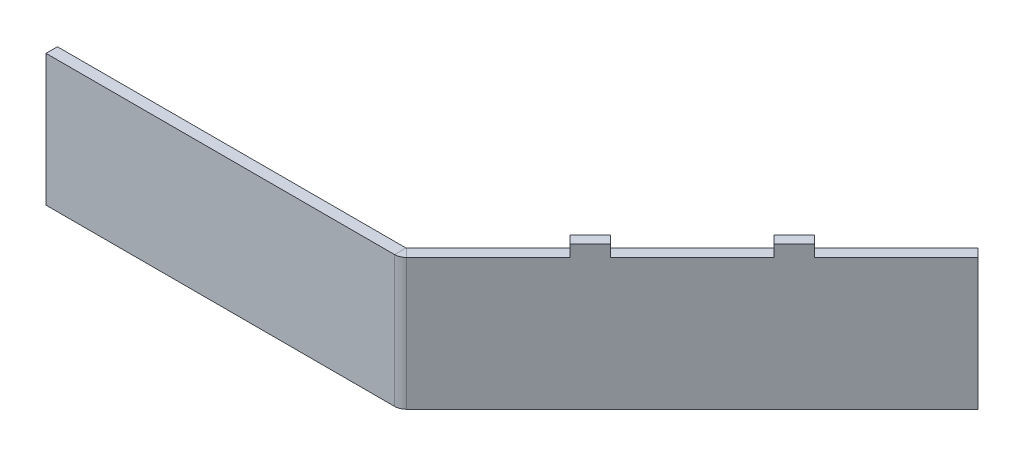
ISO-10303-21;
HEADER;
FILE_DESCRIPTION(('STEP AP214'),'2;1');
FILE_NAME('part.step','',(''),(''),'','','');
FILE_SCHEMA(('AUTOMOTIVE_DESIGN { 1 0 10303 214 1 1 1 1 }'));
ENDSEC;
DATA;
#1=APPLICATION_CONTEXT('core data for automotive mechanical design processes');
#2=APPLICATION_PROTOCOL_DEFINITION('international standard','automotive_design',2000,#1);
#3=PRODUCT_CONTEXT('',#1,'mechanical');
#4=PRODUCT('Part','Part','',(#3));
#5=PRODUCT_RELATED_PRODUCT_CATEGORY('part','',(#4));
#6=PRODUCT_DEFINITION_FORMATION('','',#4);
#7=PRODUCT_DEFINITION_CONTEXT('part definition',#1,'design');
#8=PRODUCT_DEFINITION('design','',#6,#7);
#9=PRODUCT_DEFINITION_SHAPE('','',#8);
#10=(LENGTH_UNIT() NAMED_UNIT(*) SI_UNIT(.MILLI.,.METRE.));
#11=(NAMED_UNIT(*) PLANE_ANGLE_UNIT() SI_UNIT($,.RADIAN.));
#12=(NAMED_UNIT(*) SI_UNIT($,.STERADIAN.) SOLID_ANGLE_UNIT());
#13=UNCERTAINTY_MEASURE_WITH_UNIT(LENGTH_MEASURE(1.E-05),#10,'distance_accuracy_value','');
#14=(GEOMETRIC_REPRESENTATION_CONTEXT(3) GLOBAL_UNCERTAINTY_ASSIGNED_CONTEXT((#13)) GLOBAL_UNIT_ASSIGNED_CONTEXT((#10,
#11,#12)) REPRESENTATION_CONTEXT('',''));
#15=CARTESIAN_POINT('',(0.,0.,0.));
#16=DIRECTION('',(0.,0.,1.));
#17=DIRECTION('',(1.,0.,0.));
#18=AXIS2_PLACEMENT_3D('',#15,#16,#17);
#19=CARTESIAN_POINT('',(-498.,-178.,-277.306535680569));
#20=DIRECTION('',(1.,0.,0.));
#21=DIRECTION('',(0.,0.,-1.));
#22=AXIS2_PLACEMENT_3D('',#19,#20,#21);
#23=PLANE('',#22);
#24=DIRECTION('',(0.,0.,1.));
#25=VECTOR('',#24,1.);
#26=CARTESIAN_POINT('',(-498.,-203.,-277.306535680568));
#27=LINE('',#26,#25);
#28=CARTESIAN_POINT('',(-498.,-203.,-149.));
#29=VERTEX_POINT('',#28);
#30=CARTESIAN_POINT('',(-498.,-203.,-147.));
#31=VERTEX_POINT('',#30);
#32=EDGE_CURVE('E206',#29,#31,#27,.T.);
#33=ORIENTED_EDGE('',*,*,#32,.T.);
#34=DIRECTION('',(0.,-1.,0.));
#35=VECTOR('',#34,1.);
#36=CARTESIAN_POINT('',(-498.,-203.,-147.));
#37=LINE('',#36,#35);
#38=CARTESIAN_POINT('',(-498.,-180.,-147.));
#39=VERTEX_POINT('',#38);
#40=EDGE_CURVE('E185',#39,#31,#37,.T.);
#41=ORIENTED_EDGE('',*,*,#40,.F.);
#42=DIRECTION('',(0.,0.,1.));
#43=VECTOR('',#42,1.);
#44=CARTESIAN_POINT('',(-498.,-180.,-277.306535680569));
#45=LINE('',#44,#43);
#46=CARTESIAN_POINT('',(-498.,-180.,-149.));
#47=VERTEX_POINT('',#46);
#48=EDGE_CURVE('E247',#47,#39,#45,.T.);
#49=ORIENTED_EDGE('',*,*,#48,.F.);
#50=DIRECTION('',(0.,1.,0.));
#51=VECTOR('',#50,1.);
#52=CARTESIAN_POINT('',(-498.,-178.,-149.));
#53=LINE('',#52,#51);
#54=EDGE_CURVE('E12',#29,#47,#53,.T.);
#55=ORIENTED_EDGE('',*,*,#54,.F.);
#56=EDGE_LOOP('',(#33,#41,#49,#55));
#57=FACE_BOUND('',#56,.T.);
#58=ADVANCED_FACE('F49',(#57),#23,.F.);
#59=CARTESIAN_POINT('',(-2.4980018054066E-13,-203.,-277.306535680569));
#60=DIRECTION('',(0.,-1.,0.));
#61=DIRECTION('',(0.707106781186548,0.,-0.707106781186548));
#62=AXIS2_PLACEMENT_3D('',#59,#60,#61);
#63=PLANE('',#62);
#64=DIRECTION('',(-1.,0.,0.));
#65=VECTOR('',#64,1.);
#66=CARTESIAN_POINT('',(1.11022302462516E-13,-203.,-147.));
#67=LINE('',#66,#65);
#68=CARTESIAN_POINT('',(-437.041421356238,-203.,-147.));
#69=VERTEX_POINT('',#68);
#70=EDGE_CURVE('E199',#69,#31,#67,.T.);
#71=ORIENTED_EDGE('',*,*,#70,.T.);
#72=ORIENTED_EDGE('',*,*,#32,.F.);
#73=DIRECTION('',(1.,0.,0.));
#74=VECTOR('',#73,1.);
#75=CARTESIAN_POINT('',(-1.94289029309402E-13,-203.,-149.000000000001));
#76=LINE('',#75,#74);
#77=CARTESIAN_POINT('',(-437.041421356237,-203.,-149.));
#78=VERTEX_POINT('',#77);
#79=EDGE_CURVE('E205',#29,#78,#76,.T.);
#80=ORIENTED_EDGE('',*,*,#79,.T.);
#81=DIRECTION('',(0.,0.,1.));
#82=VECTOR('',#81,1.);
#83=CARTESIAN_POINT('',(-437.041421356237,-203.,-277.306535680569));
#84=LINE('',#83,#82);
#85=EDGE_CURVE('E186',#78,#69,#84,.T.);
#86=ORIENTED_EDGE('',*,*,#85,.T.);
#87=EDGE_LOOP('',(#71,#72,#80,#86));
#88=FACE_BOUND('',#87,.T.);
#89=ADVANCED_FACE('F209',(#88),#63,.T.);
#90=CARTESIAN_POINT('',(1.11022302462516E-13,-203.,-147.));
#91=DIRECTION('',(0.,0.,-1.));
#92=DIRECTION('',(-1.,0.,0.));
#93=AXIS2_PLACEMENT_3D('',#90,#91,#92);
#94=PLANE('',#93);
#95=ORIENTED_EDGE('',*,*,#70,.F.);
#96=DIRECTION('',(0.,1.,0.));
#97=VECTOR('',#96,1.);
#98=CARTESIAN_POINT('',(-437.041421356237,-203.,-147.));
#99=LINE('',#98,#97);
#100=CARTESIAN_POINT('',(-437.041421356237,-180.,-147.));
#101=VERTEX_POINT('',#100);
#102=EDGE_CURVE('E179',#69,#101,#99,.T.);
#103=ORIENTED_EDGE('',*,*,#102,.T.);
#104=DIRECTION('',(1.,0.,0.));
#105=VECTOR('',#104,1.);
#106=CARTESIAN_POINT('',(0.,-180.,-147.));
#107=LINE('',#106,#105);
#108=EDGE_CURVE('E81',#39,#101,#107,.T.);
#109=ORIENTED_EDGE('',*,*,#108,.F.);
#110=ORIENTED_EDGE('',*,*,#40,.T.);
#111=EDGE_LOOP('',(#95,#103,#109,#110));
#112=FACE_BOUND('',#111,.T.);
#113=ADVANCED_FACE('F200',(#112),#94,.F.);
#114=CARTESIAN_POINT('',(-500.,-180.,-277.306535680569));
#115=DIRECTION('',(0.,-1.,0.));
#116=DIRECTION('',(0.707106781186548,0.,-0.707106781186548));
#117=AXIS2_PLACEMENT_3D('',#114,#115,#116);
#118=PLANE('',#117);
#119=ORIENTED_EDGE('',*,*,#48,.T.);
#120=ORIENTED_EDGE('',*,*,#108,.T.);
#121=DIRECTION('',(0.,0.,1.));
#122=VECTOR('',#121,1.);
#123=CARTESIAN_POINT('',(-437.041421356237,-180.,-277.306535680569));
#124=LINE('',#123,#122);
#125=CARTESIAN_POINT('',(-437.041421356237,-180.,-149.));
#126=VERTEX_POINT('',#125);
#127=EDGE_CURVE('E53',#126,#101,#124,.T.);
#128=ORIENTED_EDGE('',*,*,#127,.F.);
#129=DIRECTION('',(1.,0.,0.));
#130=VECTOR('',#129,1.);
#131=CARTESIAN_POINT('',(-500.,-180.,-149.));
#132=LINE('',#131,#130);
#133=EDGE_CURVE('E235',#47,#126,#132,.T.);
#134=ORIENTED_EDGE('',*,*,#133,.F.);
#135=EDGE_LOOP('',(#119,#120,#128,#134));
#136=FACE_BOUND('',#135,.T.);
#137=ADVANCED_FACE('F256',(#136),#118,.F.);
#138=CARTESIAN_POINT('',(-500.,-180.001,-149.));
#139=DIRECTION('',(0.,0.,1.));
#140=DIRECTION('',(1.,0.,0.));
#141=AXIS2_PLACEMENT_3D('',#138,#139,#140);
#142=PLANE('',#141);
#143=ORIENTED_EDGE('',*,*,#133,.T.);
#144=DIRECTION('',(0.,-1.,0.));
#145=VECTOR('',#144,1.);
#146=CARTESIAN_POINT('',(-437.041421356237,-203.,-149.));
#147=LINE('',#146,#145);
#148=EDGE_CURVE('E60',#126,#78,#147,.T.);
#149=ORIENTED_EDGE('',*,*,#148,.T.);
#150=ORIENTED_EDGE('',*,*,#79,.F.);
#151=ORIENTED_EDGE('',*,*,#54,.T.);
#152=EDGE_LOOP('',(#143,#149,#150,#151));
#153=FACE_BOUND('',#152,.T.);
#154=ADVANCED_FACE('F51',(#153),#142,.F.);
#155=CARTESIAN_POINT('',(-397.596576938901,-203.,-397.596576938901));
#156=DIRECTION('',(0.,-1.,0.));
#157=DIRECTION('',(0.,0.,-1.));
#158=AXIS2_PLACEMENT_3D('',#155,#156,#157);
#159=PLANE('',#158);
#160=DIRECTION('',(-0.707106781186548,0.,0.707106781186547));
#161=VECTOR('',#160,1.);
#162=CARTESIAN_POINT('',(-291.585786437627,-203.,-291.585786437627));
#163=LINE('',#162,#161);
#164=CARTESIAN_POINT('',(-385.585786437627,-203.,-197.585786437627));
#165=VERTEX_POINT('',#164);
#166=CARTESIAN_POINT('',(-435.556497115746,-203.,-147.615075759508));
#167=VERTEX_POINT('',#166);
#168=EDGE_CURVE('E96',#165,#167,#163,.T.);
#169=ORIENTED_EDGE('',*,*,#168,.T.);
#170=DIRECTION('',(0.707106781186547,0.,0.707106781186547));
#171=VECTOR('',#170,1.);
#172=CARTESIAN_POINT('',(-541.567287617019,-203.,-253.625866260782));
#173=LINE('',#172,#171);
#174=CARTESIAN_POINT('',(-436.970710678119,-203.,-149.029289321881));
#175=VERTEX_POINT('',#174);
#176=EDGE_CURVE('E194',#175,#167,#173,.T.);
#177=ORIENTED_EDGE('',*,*,#176,.F.);
#178=DIRECTION('',(0.707106781186548,0.,-0.707106781186547));
#179=VECTOR('',#178,1.);
#180=CARTESIAN_POINT('',(-293.,-203.,-293.));
#181=LINE('',#180,#179);
#182=CARTESIAN_POINT('',(-387.,-203.,-199.));
#183=VERTEX_POINT('',#182);
#184=EDGE_CURVE('E311',#175,#183,#181,.T.);
#185=ORIENTED_EDGE('',*,*,#184,.T.);
#186=DIRECTION('',(0.707106781186547,0.,0.707106781186547));
#187=VECTOR('',#186,1.);
#188=CARTESIAN_POINT('',(-491.596576938901,-203.,-303.596576938901));
#189=LINE('',#188,#187);
#190=EDGE_CURVE('E304',#183,#165,#189,.T.);
#191=ORIENTED_EDGE('',*,*,#190,.T.);
#192=EDGE_LOOP('',(#169,#177,#185,#191));
#193=FACE_BOUND('',#192,.T.);
#194=ADVANCED_FACE('F450',(#193),#159,.T.);
#195=CARTESIAN_POINT('',(-541.596576938901,-180.,-253.596576938901));
#196=DIRECTION('',(0.,-1.,0.));
#197=DIRECTION('',(0.,0.,-1.));
#198=AXIS2_PLACEMENT_3D('',#195,#196,#197);
#199=PLANE('',#198);
#200=DIRECTION('',(0.707106781186547,0.,0.707106781186547));
#201=VECTOR('',#200,1.);
#202=CARTESIAN_POINT('',(-541.567287617019,-180.,-253.625866260782));
#203=LINE('',#202,#201);
#204=CARTESIAN_POINT('',(-436.970710678119,-180.,-149.029289321881));
#205=VERTEX_POINT('',#204);
#206=CARTESIAN_POINT('',(-435.556497115746,-180.,-147.615075759508));
#207=VERTEX_POINT('',#206);
#208=EDGE_CURVE('E266',#205,#207,#203,.T.);
#209=ORIENTED_EDGE('',*,*,#208,.T.);
#210=DIRECTION('',(0.707106781186548,0.,-0.707106781186547));
#211=VECTOR('',#210,1.);
#212=CARTESIAN_POINT('',(-291.585786437627,-180.,-291.585786437627));
#213=LINE('',#212,#211);
#214=CARTESIAN_POINT('',(-421.276142374915,-180.,-161.895430500338));
#215=VERTEX_POINT('',#214);
#216=EDGE_CURVE('E104',#207,#215,#213,.T.);
#217=ORIENTED_EDGE('',*,*,#216,.T.);
#218=DIRECTION('',(0.707106781186547,0.,0.707106781186547));
#219=VECTOR('',#218,1.);
#220=CARTESIAN_POINT('',(-527.286932876189,-180.,-267.906221001612));
#221=LINE('',#220,#219);
#222=CARTESIAN_POINT('',(-422.690355937288,-180.,-163.309644062712));
#223=VERTEX_POINT('',#222);
#224=EDGE_CURVE('E268',#223,#215,#221,.T.);
#225=ORIENTED_EDGE('',*,*,#224,.F.);
#226=DIRECTION('',(0.707106781186548,0.,-0.707106781186548));
#227=VECTOR('',#226,1.);
#228=CARTESIAN_POINT('',(-437.,-180.,-149.));
#229=LINE('',#228,#227);
#230=EDGE_CURVE('E367',#205,#223,#229,.T.);
#231=ORIENTED_EDGE('',*,*,#230,.F.);
#232=EDGE_LOOP('',(#209,#217,#225,#231));
#233=FACE_BOUND('',#232,.T.);
#234=ADVANCED_FACE('F429',(#233),#199,.F.);
#235=CARTESIAN_POINT('',(-527.286932876189,-180.,-267.906221001612));
#236=DIRECTION('',(0.707106781186547,0.,-0.707106781186547));
#237=DIRECTION('',(-0.707106781186548,0.,-0.707106781186548));
#238=AXIS2_PLACEMENT_3D('',#235,#236,#237);
#239=PLANE('',#238);
#240=ORIENTED_EDGE('',*,*,#224,.T.);
#241=DIRECTION('',(0.,1.,0.));
#242=VECTOR('',#241,1.);
#243=CARTESIAN_POINT('',(-421.276142374915,-180.,-161.895430500339));
#244=LINE('',#243,#242);
#245=CARTESIAN_POINT('',(-421.276142374915,-178.,-161.895430500338));
#246=VERTEX_POINT('',#245);
#247=EDGE_CURVE('E356',#215,#246,#244,.T.);
#248=ORIENTED_EDGE('',*,*,#247,.T.);
#249=DIRECTION('',(0.707106781186547,0.,0.707106781186547));
#250=VECTOR('',#249,1.);
#251=CARTESIAN_POINT('',(-527.286932876189,-178.,-267.906221001612));
#252=LINE('',#251,#250);
#253=CARTESIAN_POINT('',(-422.690355937288,-178.,-163.309644062712));
#254=VERTEX_POINT('',#253);
#255=EDGE_CURVE('E273',#254,#246,#252,.T.);
#256=ORIENTED_EDGE('',*,*,#255,.F.);
#257=DIRECTION('',(0.,1.,0.));
#258=VECTOR('',#257,1.);
#259=CARTESIAN_POINT('',(-422.690355937288,-180.,-163.309644062712));
#260=LINE('',#259,#258);
#261=EDGE_CURVE('E371',#223,#254,#260,.T.);
#262=ORIENTED_EDGE('',*,*,#261,.F.);
#263=EDGE_LOOP('',(#240,#248,#256,#262));
#264=FACE_BOUND('',#263,.T.);
#265=ADVANCED_FACE('F427',(#264),#239,.F.);
#266=CARTESIAN_POINT('',(-523.751398970257,-178.,-271.441754907545));
#267=DIRECTION('',(0.,-1.,0.));
#268=DIRECTION('',(0.,0.,-1.));
#269=AXIS2_PLACEMENT_3D('',#266,#267,#268);
#270=PLANE('',#269);
#271=ORIENTED_EDGE('',*,*,#255,.T.);
#272=DIRECTION('',(0.707106781186547,0.,-0.707106781186547));
#273=VECTOR('',#272,1.);
#274=CARTESIAN_POINT('',(-417.740608468983,-178.,-165.430964406271));
#275=LINE('',#274,#273);
#276=CARTESIAN_POINT('',(-417.740608468983,-178.,-165.430964406271));
#277=VERTEX_POINT('',#276);
#278=EDGE_CURVE('E349',#246,#277,#275,.T.);
#279=ORIENTED_EDGE('',*,*,#278,.T.);
#280=DIRECTION('',(0.707106781186547,0.,0.707106781186547));
#281=VECTOR('',#280,1.);
#282=CARTESIAN_POINT('',(-523.751398970257,-178.,-271.441754907545));
#283=LINE('',#282,#281);
#284=CARTESIAN_POINT('',(-419.154822031356,-178.,-166.845177968644));
#285=VERTEX_POINT('',#284);
#286=EDGE_CURVE('E277',#285,#277,#283,.T.);
#287=ORIENTED_EDGE('',*,*,#286,.F.);
#288=DIRECTION('',(0.707106781186547,0.,-0.707106781186547));
#289=VECTOR('',#288,1.);
#290=CARTESIAN_POINT('',(-419.154822031356,-178.,-166.845177968644));
#291=LINE('',#290,#289);
#292=EDGE_CURVE('E417',#254,#285,#291,.T.);
#293=ORIENTED_EDGE('',*,*,#292,.F.);
#294=EDGE_LOOP('',(#271,#279,#287,#293));
#295=FACE_BOUND('',#294,.T.);
#296=ADVANCED_FACE('F470',(#295),#270,.F.);
#297=CARTESIAN_POINT('',(-523.751398970257,-180.,-271.441754907545));
#298=DIRECTION('',(-0.707106781186547,0.,0.707106781186547));
#299=DIRECTION('',(0.707106781186548,0.,0.707106781186548));
#300=AXIS2_PLACEMENT_3D('',#297,#298,#299);
#301=PLANE('',#300);
#302=ORIENTED_EDGE('',*,*,#286,.T.);
#303=DIRECTION('',(0.,-1.,0.));
#304=VECTOR('',#303,1.);
#305=CARTESIAN_POINT('',(-417.740608468983,-180.,-165.430964406271));
#306=LINE('',#305,#304);
#307=CARTESIAN_POINT('',(-417.740608468982,-180.,-165.430964406271));
#308=VERTEX_POINT('',#307);
#309=EDGE_CURVE('E346',#277,#308,#306,.T.);
#310=ORIENTED_EDGE('',*,*,#309,.T.);
#311=DIRECTION('',(0.707106781186547,0.,0.707106781186547));
#312=VECTOR('',#311,1.);
#313=CARTESIAN_POINT('',(-523.751398970256,-180.,-271.441754907545));
#314=LINE('',#313,#312);
#315=CARTESIAN_POINT('',(-419.154822031356,-180.,-166.845177968644));
#316=VERTEX_POINT('',#315);
#317=EDGE_CURVE('E281',#316,#308,#314,.T.);
#318=ORIENTED_EDGE('',*,*,#317,.F.);
#319=DIRECTION('',(0.,-1.,0.));
#320=VECTOR('',#319,1.);
#321=CARTESIAN_POINT('',(-419.154822031356,-180.,-166.845177968644));
#322=LINE('',#321,#320);
#323=EDGE_CURVE('E392',#285,#316,#322,.T.);
#324=ORIENTED_EDGE('',*,*,#323,.F.);
#325=EDGE_LOOP('',(#302,#310,#318,#324));
#326=FACE_BOUND('',#325,.T.);
#327=ADVANCED_FACE('F475',(#326),#301,.F.);
#328=ORIENTED_EDGE('',*,*,#317,.T.);
#329=CARTESIAN_POINT('',(-403.430964406271,-180.,-179.740608468983));
#330=VERTEX_POINT('',#329);
#331=EDGE_CURVE('E328',#308,#330,#213,.T.);
#332=ORIENTED_EDGE('',*,*,#331,.T.);
#333=DIRECTION('',(0.707106781186547,0.,0.707106781186547));
#334=VECTOR('',#333,1.);
#335=CARTESIAN_POINT('',(-509.441754907545,-180.,-285.751398970257));
#336=LINE('',#335,#334);
#337=CARTESIAN_POINT('',(-404.845177968644,-180.,-181.154822031356));
#338=VERTEX_POINT('',#337);
#339=EDGE_CURVE('E285',#338,#330,#336,.T.);
#340=ORIENTED_EDGE('',*,*,#339,.F.);
#341=EDGE_CURVE('E373',#316,#338,#229,.T.);
#342=ORIENTED_EDGE('',*,*,#341,.F.);
#343=EDGE_LOOP('',(#328,#332,#340,#342));
#344=FACE_BOUND('',#343,.T.);
#345=ADVANCED_FACE('F465',(#344),#199,.F.);
#346=CARTESIAN_POINT('',(-509.441754907545,-180.,-285.751398970257));
#347=DIRECTION('',(0.707106781186547,0.,-0.707106781186547));
#348=DIRECTION('',(-0.707106781186548,0.,-0.707106781186548));
#349=AXIS2_PLACEMENT_3D('',#346,#347,#348);
#350=PLANE('',#349);
#351=ORIENTED_EDGE('',*,*,#339,.T.);
#352=DIRECTION('',(0.,1.,0.));
#353=VECTOR('',#352,1.);
#354=CARTESIAN_POINT('',(-403.430964406271,-180.,-179.740608468983));
#355=LINE('',#354,#353);
#356=CARTESIAN_POINT('',(-403.430964406271,-178.,-179.740608468983));
#357=VERTEX_POINT('',#356);
#358=EDGE_CURVE('E350',#330,#357,#355,.T.);
#359=ORIENTED_EDGE('',*,*,#358,.T.);
#360=DIRECTION('',(0.707106781186547,0.,0.707106781186547));
#361=VECTOR('',#360,1.);
#362=CARTESIAN_POINT('',(-509.441754907545,-178.,-285.751398970257));
#363=LINE('',#362,#361);
#364=CARTESIAN_POINT('',(-404.845177968644,-178.,-181.154822031356));
#365=VERTEX_POINT('',#364);
#366=EDGE_CURVE('E289',#365,#357,#363,.T.);
#367=ORIENTED_EDGE('',*,*,#366,.F.);
#368=DIRECTION('',(0.,1.,0.));
#369=VECTOR('',#368,1.);
#370=CARTESIAN_POINT('',(-404.845177968644,-180.,-181.154822031356));
#371=LINE('',#370,#369);
#372=EDGE_CURVE('E387',#338,#365,#371,.T.);
#373=ORIENTED_EDGE('',*,*,#372,.F.);
#374=EDGE_LOOP('',(#351,#359,#367,#373));
#375=FACE_BOUND('',#374,.T.);
#376=ADVANCED_FACE('F474',(#375),#350,.F.);
#377=CARTESIAN_POINT('',(-505.906221001612,-178.,-289.286932876189));
#378=DIRECTION('',(0.,-1.,0.));
#379=DIRECTION('',(0.,0.,-1.));
#380=AXIS2_PLACEMENT_3D('',#377,#378,#379);
#381=PLANE('',#380);
#382=ORIENTED_EDGE('',*,*,#366,.T.);
#383=DIRECTION('',(0.70710678118655,0.,-0.707106781186545));
#384=VECTOR('',#383,1.);
#385=CARTESIAN_POINT('',(-399.895430500338,-178.,-183.276142374916));
#386=LINE('',#385,#384);
#387=CARTESIAN_POINT('',(-399.895430500338,-178.,-183.276142374915));
#388=VERTEX_POINT('',#387);
#389=EDGE_CURVE('E496',#357,#388,#386,.T.);
#390=ORIENTED_EDGE('',*,*,#389,.T.);
#391=DIRECTION('',(0.707106781186547,0.,0.707106781186547));
#392=VECTOR('',#391,1.);
#393=CARTESIAN_POINT('',(-505.906221001612,-178.,-289.286932876189));
#394=LINE('',#393,#392);
#395=CARTESIAN_POINT('',(-401.309644062711,-178.,-184.690355937289));
#396=VERTEX_POINT('',#395);
#397=EDGE_CURVE('E293',#396,#388,#394,.T.);
#398=ORIENTED_EDGE('',*,*,#397,.F.);
#399=DIRECTION('',(0.70710678118655,0.,-0.707106781186545));
#400=VECTOR('',#399,1.);
#401=CARTESIAN_POINT('',(-401.309644062711,-178.,-184.690355937289));
#402=LINE('',#401,#400);
#403=EDGE_CURVE('E391',#365,#396,#402,.T.);
#404=ORIENTED_EDGE('',*,*,#403,.F.);
#405=EDGE_LOOP('',(#382,#390,#398,#404));
#406=FACE_BOUND('',#405,.T.);
#407=ADVANCED_FACE('F485',(#406),#381,.F.);
#408=CARTESIAN_POINT('',(-505.906221001612,-180.,-289.286932876189));
#409=DIRECTION('',(-0.707106781186547,0.,0.707106781186547));
#410=DIRECTION('',(0.707106781186548,0.,0.707106781186548));
#411=AXIS2_PLACEMENT_3D('',#408,#409,#410);
#412=PLANE('',#411);
#413=ORIENTED_EDGE('',*,*,#397,.T.);
#414=DIRECTION('',(0.,-1.,0.));
#415=VECTOR('',#414,1.);
#416=CARTESIAN_POINT('',(-399.895430500338,-180.,-183.276142374916));
#417=LINE('',#416,#415);
#418=CARTESIAN_POINT('',(-399.895430500338,-180.,-183.276142374915));
#419=VERTEX_POINT('',#418);
#420=EDGE_CURVE('E492',#388,#419,#417,.T.);
#421=ORIENTED_EDGE('',*,*,#420,.T.);
#422=DIRECTION('',(0.707106781186547,0.,0.707106781186547));
#423=VECTOR('',#422,1.);
#424=CARTESIAN_POINT('',(-505.906221001612,-180.,-289.286932876189));
#425=LINE('',#424,#423);
#426=CARTESIAN_POINT('',(-401.309644062711,-180.,-184.690355937289));
#427=VERTEX_POINT('',#426);
#428=EDGE_CURVE('E297',#427,#419,#425,.T.);
#429=ORIENTED_EDGE('',*,*,#428,.F.);
#430=DIRECTION('',(0.,-1.,0.));
#431=VECTOR('',#430,1.);
#432=CARTESIAN_POINT('',(-401.309644062711,-180.,-184.690355937289));
#433=LINE('',#432,#431);
#434=EDGE_CURVE('E398',#396,#427,#433,.T.);
#435=ORIENTED_EDGE('',*,*,#434,.F.);
#436=EDGE_LOOP('',(#413,#421,#429,#435));
#437=FACE_BOUND('',#436,.T.);
#438=ADVANCED_FACE('F479',(#437),#412,.F.);
#439=ORIENTED_EDGE('',*,*,#428,.T.);
#440=CARTESIAN_POINT('',(-385.585786437627,-180.,-197.585786437627));
#441=VERTEX_POINT('',#440);
#442=EDGE_CURVE('E329',#419,#441,#213,.T.);
#443=ORIENTED_EDGE('',*,*,#442,.T.);
#444=DIRECTION('',(0.707106781186547,0.,0.707106781186547));
#445=VECTOR('',#444,1.);
#446=CARTESIAN_POINT('',(-491.596576938901,-180.,-303.596576938901));
#447=LINE('',#446,#445);
#448=CARTESIAN_POINT('',(-387.,-180.,-199.));
#449=VERTEX_POINT('',#448);
#450=EDGE_CURVE('E301',#449,#441,#447,.T.);
#451=ORIENTED_EDGE('',*,*,#450,.F.);
#452=EDGE_CURVE('E372',#427,#449,#229,.T.);
#453=ORIENTED_EDGE('',*,*,#452,.F.);
#454=EDGE_LOOP('',(#439,#443,#451,#453));
#455=FACE_BOUND('',#454,.T.);
#456=ADVANCED_FACE('F466',(#455),#199,.F.);
#457=CARTESIAN_POINT('',(-491.596576938901,-180.001,-303.596576938901));
#458=DIRECTION('',(0.707106781186547,0.,-0.707106781186547));
#459=DIRECTION('',(-0.707106781186548,0.,-0.707106781186548));
#460=AXIS2_PLACEMENT_3D('',#457,#458,#459);
#461=PLANE('',#460);
#462=DIRECTION('',(0.,1.,0.));
#463=VECTOR('',#462,1.);
#464=CARTESIAN_POINT('',(-385.585786437627,-180.001,-197.585786437627));
#465=LINE('',#464,#463);
#466=EDGE_CURVE('E228',#165,#441,#465,.T.);
#467=ORIENTED_EDGE('',*,*,#466,.F.);
#468=ORIENTED_EDGE('',*,*,#190,.F.);
#469=DIRECTION('',(0.,1.,0.));
#470=VECTOR('',#469,1.);
#471=CARTESIAN_POINT('',(-387.,-180.001,-199.));
#472=LINE('',#471,#470);
#473=EDGE_CURVE('E402',#183,#449,#472,.T.);
#474=ORIENTED_EDGE('',*,*,#473,.T.);
#475=ORIENTED_EDGE('',*,*,#450,.T.);
#476=EDGE_LOOP('',(#467,#468,#474,#475));
#477=FACE_BOUND('',#476,.T.);
#478=ADVANCED_FACE('F478',(#477),#461,.T.);
#479=CARTESIAN_POINT('',(-437.,-180.001,-149.));
#480=DIRECTION('',(0.707106781186548,0.,0.707106781186548));
#481=DIRECTION('',(0.707106781186548,0.,-0.707106781186548));
#482=AXIS2_PLACEMENT_3D('',#479,#480,#481);
#483=PLANE('',#482);
#484=DIRECTION('',(0.,-1.,0.));
#485=VECTOR('',#484,1.);
#486=CARTESIAN_POINT('',(-436.970710678119,-203.,-149.029289321881));
#487=LINE('',#486,#485);
#488=EDGE_CURVE('E307',#205,#175,#487,.T.);
#489=ORIENTED_EDGE('',*,*,#488,.F.);
#490=ORIENTED_EDGE('',*,*,#230,.T.);
#491=ORIENTED_EDGE('',*,*,#261,.T.);
#492=ORIENTED_EDGE('',*,*,#292,.T.);
#493=ORIENTED_EDGE('',*,*,#323,.T.);
#494=ORIENTED_EDGE('',*,*,#341,.T.);
#495=ORIENTED_EDGE('',*,*,#372,.T.);
#496=ORIENTED_EDGE('',*,*,#403,.T.);
#497=ORIENTED_EDGE('',*,*,#434,.T.);
#498=ORIENTED_EDGE('',*,*,#452,.T.);
#499=ORIENTED_EDGE('',*,*,#473,.F.);
#500=ORIENTED_EDGE('',*,*,#184,.F.);
#501=EDGE_LOOP('',(#489,#490,#491,#492,#493,#494,#495,#496,#497,#498,#499,#500));
#502=FACE_BOUND('',#501,.T.);
#503=ADVANCED_FACE('F424',(#502),#483,.F.);
#504=CARTESIAN_POINT('',(-291.585786437627,-203.,-291.585786437627));
#505=DIRECTION('',(-0.707106781186547,0.,-0.707106781186548));
#506=DIRECTION('',(-0.707106781186548,0.,0.707106781186547));
#507=AXIS2_PLACEMENT_3D('',#504,#505,#506);
#508=PLANE('',#507);
#509=DIRECTION('',(0.,1.,0.));
#510=VECTOR('',#509,1.);
#511=CARTESIAN_POINT('',(-435.556497115746,-203.,-147.615075759508));
#512=LINE('',#511,#510);
#513=EDGE_CURVE('E360',#167,#207,#512,.T.);
#514=ORIENTED_EDGE('',*,*,#513,.F.);
#515=ORIENTED_EDGE('',*,*,#168,.F.);
#516=ORIENTED_EDGE('',*,*,#466,.T.);
#517=ORIENTED_EDGE('',*,*,#442,.F.);
#518=ORIENTED_EDGE('',*,*,#420,.F.);
#519=ORIENTED_EDGE('',*,*,#389,.F.);
#520=ORIENTED_EDGE('',*,*,#358,.F.);
#521=ORIENTED_EDGE('',*,*,#331,.F.);
#522=ORIENTED_EDGE('',*,*,#309,.F.);
#523=ORIENTED_EDGE('',*,*,#278,.F.);
#524=ORIENTED_EDGE('',*,*,#247,.F.);
#525=ORIENTED_EDGE('',*,*,#216,.F.);
#526=EDGE_LOOP('',(#514,#515,#516,#517,#518,#519,#520,#521,#522,#523,#524,#525));
#527=FACE_BOUND('',#526,.T.);
#528=ADVANCED_FACE('F490',(#527),#508,.F.);
#529=CARTESIAN_POINT('',(-437.041421356237,-203.,-149.1));
#530=DIRECTION('',(0.,-1.,0.));
#531=DIRECTION('',(0.,0.,-1.));
#532=AXIS2_PLACEMENT_3D('',#529,#530,#531);
#533=PLANE('',#532);
#534=ORIENTED_EDGE('',*,*,#85,.F.);
#535=CARTESIAN_POINT('',(-437.041421356237,-203.,-149.1));
#536=DIRECTION('',(0.,1.,0.));
#537=DIRECTION('',(0.,0.,1.));
#538=AXIS2_PLACEMENT_3D('',#535,#536,#537);
#539=CIRCLE('',#538,0.0999999999999694);
#540=EDGE_CURVE('E320',#78,#175,#539,.T.);
#541=ORIENTED_EDGE('',*,*,#540,.T.);
#542=ORIENTED_EDGE('',*,*,#176,.T.);
#543=CARTESIAN_POINT('',(-437.041421356237,-203.,-149.1));
#544=DIRECTION('',(0.,1.,0.));
#545=DIRECTION('',(0.,0.,1.));
#546=AXIS2_PLACEMENT_3D('',#543,#544,#545);
#547=CIRCLE('',#546,2.09999999999993);
#548=EDGE_CURVE('E182',#69,#167,#547,.T.);
#549=ORIENTED_EDGE('',*,*,#548,.F.);
#550=EDGE_LOOP('',(#534,#541,#542,#549));
#551=FACE_BOUND('',#550,.T.);
#552=ADVANCED_FACE('F190',(#551),#533,.T.);
#553=CARTESIAN_POINT('',(-437.041421356237,-180.,-149.1));
#554=DIRECTION('',(0.,1.,0.));
#555=DIRECTION('',(0.,0.,1.));
#556=AXIS2_PLACEMENT_3D('',#553,#554,#555);
#557=PLANE('',#556);
#558=CARTESIAN_POINT('',(-437.041421356237,-180.,-149.1));
#559=DIRECTION('',(0.,1.,0.));
#560=DIRECTION('',(0.,0.,1.));
#561=AXIS2_PLACEMENT_3D('',#558,#559,#560);
#562=CIRCLE('',#561,0.0999999999999694);
#563=EDGE_CURVE('E196',#205,#126,#562,.F.);
#564=ORIENTED_EDGE('',*,*,#563,.T.);
#565=ORIENTED_EDGE('',*,*,#127,.T.);
#566=CARTESIAN_POINT('',(-437.041421356237,-180.,-149.1));
#567=DIRECTION('',(0.,1.,0.));
#568=DIRECTION('',(0.,0.,1.));
#569=AXIS2_PLACEMENT_3D('',#566,#567,#568);
#570=CIRCLE('',#569,2.09999999999993);
#571=EDGE_CURVE('E88',#207,#101,#570,.F.);
#572=ORIENTED_EDGE('',*,*,#571,.F.);
#573=ORIENTED_EDGE('',*,*,#208,.F.);
#574=EDGE_LOOP('',(#564,#565,#572,#573));
#575=FACE_BOUND('',#574,.T.);
#576=ADVANCED_FACE('F433',(#575),#557,.T.);
#577=CARTESIAN_POINT('',(-437.041421356237,-339.486747089545,-149.1));
#578=DIRECTION('',(0.,1.,0.));
#579=DIRECTION('',(0.,0.,1.));
#580=AXIS2_PLACEMENT_3D('',#577,#578,#579);
#581=CYLINDRICAL_SURFACE('',#580,2.09999999999993);
#582=ORIENTED_EDGE('',*,*,#513,.T.);
#583=ORIENTED_EDGE('',*,*,#571,.T.);
#584=ORIENTED_EDGE('',*,*,#102,.F.);
#585=ORIENTED_EDGE('',*,*,#548,.T.);
#586=EDGE_LOOP('',(#582,#583,#584,#585));
#587=FACE_BOUND('',#586,.T.);
#588=ADVANCED_FACE('F181',(#587),#581,.T.);
#589=CARTESIAN_POINT('',(-437.041421356237,-339.486747089545,-149.1));
#590=DIRECTION('',(0.,1.,0.));
#591=DIRECTION('',(0.,0.,1.));
#592=AXIS2_PLACEMENT_3D('',#589,#590,#591);
#593=CYLINDRICAL_SURFACE('',#592,0.0999999999999694);
#594=ORIENTED_EDGE('',*,*,#488,.T.);
#595=ORIENTED_EDGE('',*,*,#540,.F.);
#596=ORIENTED_EDGE('',*,*,#148,.F.);
#597=ORIENTED_EDGE('',*,*,#563,.F.);
#598=EDGE_LOOP('',(#594,#595,#596,#597));
#599=FACE_BOUND('',#598,.T.);
#600=ADVANCED_FACE('F434',(#599),#593,.F.);
#601=CLOSED_SHELL('',(#58,#89,#113,#137,#154,#194,#234,#265,#296,#327,#345,#376,#407,#438,#456,
#478,#503,#528,#552,#576,#588,#600));
#602=MANIFOLD_SOLID_BREP('B2',#601);
#603=ADVANCED_BREP_SHAPE_REPRESENTATION('',(#18,#602),#14);
#604=SHAPE_DEFINITION_REPRESENTATION(#9,#603);
ENDSEC;
END-ISO-10303-21;
